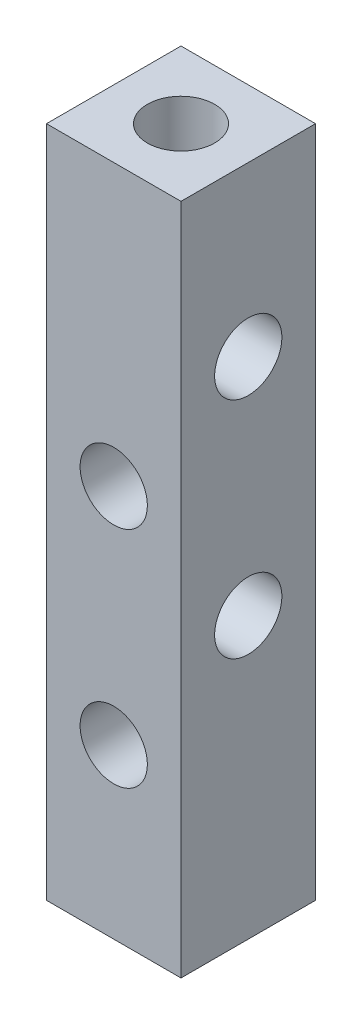
ISO-10303-21;
HEADER;
FILE_DESCRIPTION(('STEP AP214'),'2;1');
FILE_NAME('part.step','',(''),(''),'','','');
FILE_SCHEMA(('AUTOMOTIVE_DESIGN { 1 0 10303 214 1 1 1 1 }'));
ENDSEC;
DATA;
#1=APPLICATION_CONTEXT('core data for automotive mechanical design processes');
#2=APPLICATION_PROTOCOL_DEFINITION('international standard','automotive_design',2000,#1);
#3=PRODUCT_CONTEXT('',#1,'mechanical');
#4=PRODUCT('Part','Part','',(#3));
#5=PRODUCT_RELATED_PRODUCT_CATEGORY('part','',(#4));
#6=PRODUCT_DEFINITION_FORMATION('','',#4);
#7=PRODUCT_DEFINITION_CONTEXT('part definition',#1,'design');
#8=PRODUCT_DEFINITION('design','',#6,#7);
#9=PRODUCT_DEFINITION_SHAPE('','',#8);
#10=(LENGTH_UNIT() NAMED_UNIT(*) SI_UNIT(.MILLI.,.METRE.));
#11=(NAMED_UNIT(*) PLANE_ANGLE_UNIT() SI_UNIT($,.RADIAN.));
#12=(NAMED_UNIT(*) SI_UNIT($,.STERADIAN.) SOLID_ANGLE_UNIT());
#13=UNCERTAINTY_MEASURE_WITH_UNIT(LENGTH_MEASURE(1.E-05),#10,'distance_accuracy_value','');
#14=(GEOMETRIC_REPRESENTATION_CONTEXT(3) GLOBAL_UNCERTAINTY_ASSIGNED_CONTEXT((#13)) GLOBAL_UNIT_ASSIGNED_CONTEXT((#10,
#11,#12)) REPRESENTATION_CONTEXT('',''));
#15=CARTESIAN_POINT('',(0.,0.,0.));
#16=DIRECTION('',(0.,0.,1.));
#17=DIRECTION('',(1.,0.,0.));
#18=AXIS2_PLACEMENT_3D('',#15,#16,#17);
#19=CARTESIAN_POINT('',(3.,30.,3.));
#20=DIRECTION('',(-1.,0.,0.));
#21=DIRECTION('',(0.,0.,1.));
#22=AXIS2_PLACEMENT_3D('',#19,#20,#21);
#23=PLANE('',#22);
#24=CARTESIAN_POINT('',(3.,22.5,0.));
#25=DIRECTION('',(1.,0.,0.));
#26=DIRECTION('',(0.,0.,-1.));
#27=AXIS2_PLACEMENT_3D('',#24,#25,#26);
#28=CIRCLE('',#27,1.5);
#29=CARTESIAN_POINT('',(3.,22.5,-1.5));
#30=VERTEX_POINT('',#29);
#31=EDGE_CURVE('E126',#30,#30,#28,.T.);
#32=ORIENTED_EDGE('',*,*,#31,.F.);
#33=EDGE_LOOP('',(#32));
#34=FACE_BOUND('',#33,.T.);
#35=CARTESIAN_POINT('',(3.,12.5,0.));
#36=DIRECTION('',(1.,0.,0.));
#37=DIRECTION('',(0.,0.,-1.));
#38=AXIS2_PLACEMENT_3D('',#35,#36,#37);
#39=CIRCLE('',#38,1.5);
#40=CARTESIAN_POINT('',(3.,12.5,-1.5));
#41=VERTEX_POINT('',#40);
#42=EDGE_CURVE('E127',#41,#41,#39,.T.);
#43=ORIENTED_EDGE('',*,*,#42,.F.);
#44=EDGE_LOOP('',(#43));
#45=FACE_BOUND('',#44,.T.);
#46=DIRECTION('',(0.,0.,-1.));
#47=VECTOR('',#46,1.);
#48=CARTESIAN_POINT('',(3.,0.,3.));
#49=LINE('',#48,#47);
#50=CARTESIAN_POINT('',(3.,0.,3.));
#51=VERTEX_POINT('',#50);
#52=CARTESIAN_POINT('',(3.,0.,-3.));
#53=VERTEX_POINT('',#52);
#54=EDGE_CURVE('E97',#51,#53,#49,.T.);
#55=ORIENTED_EDGE('',*,*,#54,.T.);
#56=DIRECTION('',(0.,-1.,0.));
#57=VECTOR('',#56,1.);
#58=CARTESIAN_POINT('',(3.,30.,-3.));
#59=LINE('',#58,#57);
#60=CARTESIAN_POINT('',(3.,30.,-3.));
#61=VERTEX_POINT('',#60);
#62=EDGE_CURVE('E11',#61,#53,#59,.T.);
#63=ORIENTED_EDGE('',*,*,#62,.F.);
#64=DIRECTION('',(0.,0.,-1.));
#65=VECTOR('',#64,1.);
#66=CARTESIAN_POINT('',(3.,30.,3.));
#67=LINE('',#66,#65);
#68=CARTESIAN_POINT('',(3.,30.,3.));
#69=VERTEX_POINT('',#68);
#70=EDGE_CURVE('E85',#69,#61,#67,.T.);
#71=ORIENTED_EDGE('',*,*,#70,.F.);
#72=DIRECTION('',(0.,-1.,0.));
#73=VECTOR('',#72,1.);
#74=CARTESIAN_POINT('',(3.,30.,3.));
#75=LINE('',#74,#73);
#76=EDGE_CURVE('E93',#69,#51,#75,.T.);
#77=ORIENTED_EDGE('',*,*,#76,.T.);
#78=EDGE_LOOP('',(#55,#63,#71,#77));
#79=FACE_BOUND('',#78,.T.);
#80=ADVANCED_FACE('F34',(#34,#45,#79),#23,.F.);
#81=CARTESIAN_POINT('',(-3.,30.,-3.));
#82=DIRECTION('',(0.,0.,1.));
#83=DIRECTION('',(1.,0.,0.));
#84=AXIS2_PLACEMENT_3D('',#81,#82,#83);
#85=PLANE('',#84);
#86=CARTESIAN_POINT('',(0.,17.5,-3.));
#87=DIRECTION('',(0.,0.,1.));
#88=DIRECTION('',(1.,0.,0.));
#89=AXIS2_PLACEMENT_3D('',#86,#87,#88);
#90=CIRCLE('',#89,1.5);
#91=CARTESIAN_POINT('',(1.5,17.5,-3.));
#92=VERTEX_POINT('',#91);
#93=EDGE_CURVE('E100',#92,#92,#90,.F.);
#94=ORIENTED_EDGE('',*,*,#93,.F.);
#95=EDGE_LOOP('',(#94));
#96=FACE_BOUND('',#95,.T.);
#97=CARTESIAN_POINT('',(0.,7.5,-3.));
#98=DIRECTION('',(0.,0.,1.));
#99=DIRECTION('',(1.,0.,0.));
#100=AXIS2_PLACEMENT_3D('',#97,#98,#99);
#101=CIRCLE('',#100,1.5);
#102=CARTESIAN_POINT('',(1.5,7.5,-3.));
#103=VERTEX_POINT('',#102);
#104=EDGE_CURVE('E111',#103,#103,#101,.F.);
#105=ORIENTED_EDGE('',*,*,#104,.F.);
#106=EDGE_LOOP('',(#105));
#107=FACE_BOUND('',#106,.T.);
#108=DIRECTION('',(-1.,0.,0.));
#109=VECTOR('',#108,1.);
#110=CARTESIAN_POINT('',(-3.,0.,-3.));
#111=LINE('',#110,#109);
#112=CARTESIAN_POINT('',(-3.,0.,-3.));
#113=VERTEX_POINT('',#112);
#114=EDGE_CURVE('E89',#53,#113,#111,.T.);
#115=ORIENTED_EDGE('',*,*,#114,.T.);
#116=DIRECTION('',(0.,-1.,0.));
#117=VECTOR('',#116,1.);
#118=CARTESIAN_POINT('',(-3.,30.,-3.));
#119=LINE('',#118,#117);
#120=CARTESIAN_POINT('',(-3.,30.,-3.));
#121=VERTEX_POINT('',#120);
#122=EDGE_CURVE('E42',#121,#113,#119,.T.);
#123=ORIENTED_EDGE('',*,*,#122,.F.);
#124=DIRECTION('',(-1.,0.,0.));
#125=VECTOR('',#124,1.);
#126=CARTESIAN_POINT('',(-3.,30.,-3.));
#127=LINE('',#126,#125);
#128=EDGE_CURVE('E80',#61,#121,#127,.T.);
#129=ORIENTED_EDGE('',*,*,#128,.F.);
#130=ORIENTED_EDGE('',*,*,#62,.T.);
#131=EDGE_LOOP('',(#115,#123,#129,#130));
#132=FACE_BOUND('',#131,.T.);
#133=ADVANCED_FACE('F88',(#96,#107,#132),#85,.F.);
#134=CARTESIAN_POINT('',(-3.,30.,3.));
#135=DIRECTION('',(1.,0.,0.));
#136=DIRECTION('',(0.,0.,-1.));
#137=AXIS2_PLACEMENT_3D('',#134,#135,#136);
#138=PLANE('',#137);
#139=CARTESIAN_POINT('',(-3.,22.5,0.));
#140=DIRECTION('',(1.,0.,0.));
#141=DIRECTION('',(0.,0.,-1.));
#142=AXIS2_PLACEMENT_3D('',#139,#140,#141);
#143=CIRCLE('',#142,1.5);
#144=CARTESIAN_POINT('',(-3.,22.5,-1.5));
#145=VERTEX_POINT('',#144);
#146=EDGE_CURVE('E118',#145,#145,#143,.F.);
#147=ORIENTED_EDGE('',*,*,#146,.F.);
#148=EDGE_LOOP('',(#147));
#149=FACE_BOUND('',#148,.T.);
#150=CARTESIAN_POINT('',(-3.,12.5,0.));
#151=DIRECTION('',(1.,0.,0.));
#152=DIRECTION('',(0.,0.,-1.));
#153=AXIS2_PLACEMENT_3D('',#150,#151,#152);
#154=CIRCLE('',#153,1.5);
#155=CARTESIAN_POINT('',(-3.,12.5,-1.5));
#156=VERTEX_POINT('',#155);
#157=EDGE_CURVE('E123',#156,#156,#154,.F.);
#158=ORIENTED_EDGE('',*,*,#157,.F.);
#159=EDGE_LOOP('',(#158));
#160=FACE_BOUND('',#159,.T.);
#161=DIRECTION('',(0.,0.,1.));
#162=VECTOR('',#161,1.);
#163=CARTESIAN_POINT('',(-3.,0.,3.));
#164=LINE('',#163,#162);
#165=CARTESIAN_POINT('',(-3.,0.,3.));
#166=VERTEX_POINT('',#165);
#167=EDGE_CURVE('E67',#113,#166,#164,.T.);
#168=ORIENTED_EDGE('',*,*,#167,.T.);
#169=DIRECTION('',(0.,-1.,0.));
#170=VECTOR('',#169,1.);
#171=CARTESIAN_POINT('',(-3.,30.,3.));
#172=LINE('',#171,#170);
#173=CARTESIAN_POINT('',(-3.,30.,3.));
#174=VERTEX_POINT('',#173);
#175=EDGE_CURVE('E90',#174,#166,#172,.T.);
#176=ORIENTED_EDGE('',*,*,#175,.F.);
#177=DIRECTION('',(0.,0.,1.));
#178=VECTOR('',#177,1.);
#179=CARTESIAN_POINT('',(-3.,30.,3.));
#180=LINE('',#179,#178);
#181=EDGE_CURVE('E83',#121,#174,#180,.T.);
#182=ORIENTED_EDGE('',*,*,#181,.F.);
#183=ORIENTED_EDGE('',*,*,#122,.T.);
#184=EDGE_LOOP('',(#168,#176,#182,#183));
#185=FACE_BOUND('',#184,.T.);
#186=ADVANCED_FACE('F91',(#149,#160,#185),#138,.F.);
#187=CARTESIAN_POINT('',(-3.,30.,3.));
#188=DIRECTION('',(0.,0.,-1.));
#189=DIRECTION('',(-1.,0.,0.));
#190=AXIS2_PLACEMENT_3D('',#187,#188,#189);
#191=PLANE('',#190);
#192=CARTESIAN_POINT('',(0.,17.5,3.));
#193=DIRECTION('',(0.,0.,1.));
#194=DIRECTION('',(1.,0.,0.));
#195=AXIS2_PLACEMENT_3D('',#192,#193,#194);
#196=CIRCLE('',#195,1.5);
#197=CARTESIAN_POINT('',(1.5,17.5,3.));
#198=VERTEX_POINT('',#197);
#199=EDGE_CURVE('E114',#198,#198,#196,.T.);
#200=ORIENTED_EDGE('',*,*,#199,.F.);
#201=EDGE_LOOP('',(#200));
#202=FACE_BOUND('',#201,.T.);
#203=CARTESIAN_POINT('',(0.,7.5,3.));
#204=DIRECTION('',(0.,0.,1.));
#205=DIRECTION('',(1.,0.,0.));
#206=AXIS2_PLACEMENT_3D('',#203,#204,#205);
#207=CIRCLE('',#206,1.5);
#208=CARTESIAN_POINT('',(1.5,7.5,3.));
#209=VERTEX_POINT('',#208);
#210=EDGE_CURVE('E115',#209,#209,#207,.T.);
#211=ORIENTED_EDGE('',*,*,#210,.F.);
#212=EDGE_LOOP('',(#211));
#213=FACE_BOUND('',#212,.T.);
#214=DIRECTION('',(1.,0.,0.));
#215=VECTOR('',#214,1.);
#216=CARTESIAN_POINT('',(-3.,0.,3.));
#217=LINE('',#216,#215);
#218=EDGE_CURVE('E73',#166,#51,#217,.T.);
#219=ORIENTED_EDGE('',*,*,#218,.T.);
#220=ORIENTED_EDGE('',*,*,#76,.F.);
#221=DIRECTION('',(1.,0.,0.));
#222=VECTOR('',#221,1.);
#223=CARTESIAN_POINT('',(-3.,30.,3.));
#224=LINE('',#223,#222);
#225=EDGE_CURVE('E50',#174,#69,#224,.T.);
#226=ORIENTED_EDGE('',*,*,#225,.F.);
#227=ORIENTED_EDGE('',*,*,#175,.T.);
#228=EDGE_LOOP('',(#219,#220,#226,#227));
#229=FACE_BOUND('',#228,.T.);
#230=ADVANCED_FACE('F105',(#202,#213,#229),#191,.F.);
#231=CARTESIAN_POINT('',(0.,30.,0.));
#232=DIRECTION('',(0.,-1.,0.));
#233=DIRECTION('',(0.,0.,-1.));
#234=AXIS2_PLACEMENT_3D('',#231,#232,#233);
#235=PLANE('',#234);
#236=CARTESIAN_POINT('',(0.,30.,0.));
#237=DIRECTION('',(0.,1.,0.));
#238=DIRECTION('',(0.,0.,1.));
#239=AXIS2_PLACEMENT_3D('',#236,#237,#238);
#240=CIRCLE('',#239,1.5);
#241=CARTESIAN_POINT('',(0.,30.,1.5));
#242=VERTEX_POINT('',#241);
#243=EDGE_CURVE('E135',#242,#242,#240,.T.);
#244=ORIENTED_EDGE('',*,*,#243,.F.);
#245=EDGE_LOOP('',(#244));
#246=FACE_BOUND('',#245,.T.);
#247=ORIENTED_EDGE('',*,*,#70,.T.);
#248=ORIENTED_EDGE('',*,*,#128,.T.);
#249=ORIENTED_EDGE('',*,*,#181,.T.);
#250=ORIENTED_EDGE('',*,*,#225,.T.);
#251=EDGE_LOOP('',(#247,#248,#249,#250));
#252=FACE_BOUND('',#251,.T.);
#253=ADVANCED_FACE('F81',(#246,#252),#235,.F.);
#254=CARTESIAN_POINT('',(0.,0.,0.));
#255=DIRECTION('',(0.,-1.,0.));
#256=DIRECTION('',(0.,0.,-1.));
#257=AXIS2_PLACEMENT_3D('',#254,#255,#256);
#258=PLANE('',#257);
#259=CARTESIAN_POINT('',(0.,0.,0.));
#260=DIRECTION('',(0.,-1.,0.));
#261=DIRECTION('',(0.,0.,-1.));
#262=AXIS2_PLACEMENT_3D('',#259,#260,#261);
#263=CIRCLE('',#262,1.5);
#264=CARTESIAN_POINT('',(0.,0.,-1.5));
#265=VERTEX_POINT('',#264);
#266=EDGE_CURVE('E141',#265,#265,#263,.T.);
#267=ORIENTED_EDGE('',*,*,#266,.F.);
#268=EDGE_LOOP('',(#267));
#269=FACE_BOUND('',#268,.T.);
#270=ORIENTED_EDGE('',*,*,#54,.F.);
#271=ORIENTED_EDGE('',*,*,#218,.F.);
#272=ORIENTED_EDGE('',*,*,#167,.F.);
#273=ORIENTED_EDGE('',*,*,#114,.F.);
#274=EDGE_LOOP('',(#270,#271,#272,#273));
#275=FACE_BOUND('',#274,.T.);
#276=ADVANCED_FACE('F108',(#269,#275),#258,.T.);
#277=CARTESIAN_POINT('',(0.,7.5,-3.001));
#278=DIRECTION('',(0.,0.,1.));
#279=DIRECTION('',(1.,0.,0.));
#280=AXIS2_PLACEMENT_3D('',#277,#278,#279);
#281=CYLINDRICAL_SURFACE('',#280,1.5);
#282=CARTESIAN_POINT('',(1.5,7.5,3.));
#283=CARTESIAN_POINT('',(1.5,7.5,2.9375));
#284=CARTESIAN_POINT('',(1.5,7.5,2.875));
#285=CARTESIAN_POINT('',(1.5,7.5,2.75));
#286=CARTESIAN_POINT('',(1.5,7.5,2.6875));
#287=CARTESIAN_POINT('',(1.5,7.5,2.5625));
#288=CARTESIAN_POINT('',(1.5,7.5,2.5));
#289=CARTESIAN_POINT('',(1.5,7.5,2.375));
#290=CARTESIAN_POINT('',(1.5,7.5,2.3125));
#291=CARTESIAN_POINT('',(1.5,7.5,2.1875));
#292=CARTESIAN_POINT('',(1.5,7.5,2.125));
#293=CARTESIAN_POINT('',(1.5,7.5,2.));
#294=CARTESIAN_POINT('',(1.5,7.5,1.9375));
#295=CARTESIAN_POINT('',(1.5,7.5,1.8125));
#296=CARTESIAN_POINT('',(1.5,7.5,1.75));
#297=CARTESIAN_POINT('',(1.5,7.5,1.625));
#298=CARTESIAN_POINT('',(1.5,7.5,1.5625));
#299=CARTESIAN_POINT('',(1.5,7.5,1.4375));
#300=CARTESIAN_POINT('',(1.5,7.5,1.375));
#301=CARTESIAN_POINT('',(1.5,7.5,1.25));
#302=CARTESIAN_POINT('',(1.5,7.5,1.1875));
#303=CARTESIAN_POINT('',(1.5,7.5,1.0625));
#304=CARTESIAN_POINT('',(1.5,7.5,1.));
#305=CARTESIAN_POINT('',(1.5,7.5,0.875));
#306=CARTESIAN_POINT('',(1.5,7.5,0.8125));
#307=CARTESIAN_POINT('',(1.5,7.5,0.6875));
#308=CARTESIAN_POINT('',(1.5,7.5,0.625));
#309=CARTESIAN_POINT('',(1.5,7.5,0.5));
#310=CARTESIAN_POINT('',(1.5,7.5,0.4375));
#311=CARTESIAN_POINT('',(1.5,7.5,0.3125));
#312=CARTESIAN_POINT('',(1.5,7.5,0.25));
#313=CARTESIAN_POINT('',(1.5,7.5,0.125));
#314=CARTESIAN_POINT('',(1.5,7.5,0.0624999999999996));
#315=CARTESIAN_POINT('',(1.5,7.5,-0.0625000000000005));
#316=CARTESIAN_POINT('',(1.5,7.5,-0.125000000000001));
#317=CARTESIAN_POINT('',(1.5,7.5,-0.250000000000001));
#318=CARTESIAN_POINT('',(1.5,7.5,-0.3125));
#319=CARTESIAN_POINT('',(1.5,7.5,-0.4375));
#320=CARTESIAN_POINT('',(1.5,7.5,-0.5));
#321=CARTESIAN_POINT('',(1.5,7.5,-0.625000000000001));
#322=CARTESIAN_POINT('',(1.5,7.5,-0.687500000000001));
#323=CARTESIAN_POINT('',(1.5,7.5,-0.812500000000001));
#324=CARTESIAN_POINT('',(1.5,7.5,-0.875000000000001));
#325=CARTESIAN_POINT('',(1.5,7.5,-1.));
#326=CARTESIAN_POINT('',(1.5,7.5,-1.0625));
#327=CARTESIAN_POINT('',(1.5,7.5,-1.1875));
#328=CARTESIAN_POINT('',(1.5,7.5,-1.25));
#329=CARTESIAN_POINT('',(1.5,7.5,-1.375));
#330=CARTESIAN_POINT('',(1.5,7.5,-1.4375));
#331=CARTESIAN_POINT('',(1.5,7.5,-1.5625));
#332=CARTESIAN_POINT('',(1.5,7.5,-1.625));
#333=CARTESIAN_POINT('',(1.5,7.5,-1.75));
#334=CARTESIAN_POINT('',(1.5,7.5,-1.8125));
#335=CARTESIAN_POINT('',(1.5,7.5,-1.9375));
#336=CARTESIAN_POINT('',(1.5,7.5,-2.));
#337=CARTESIAN_POINT('',(1.5,7.5,-2.125));
#338=CARTESIAN_POINT('',(1.5,7.5,-2.1875));
#339=CARTESIAN_POINT('',(1.5,7.5,-2.3125));
#340=CARTESIAN_POINT('',(1.5,7.5,-2.375));
#341=CARTESIAN_POINT('',(1.5,7.5,-2.5));
#342=CARTESIAN_POINT('',(1.5,7.5,-2.5625));
#343=CARTESIAN_POINT('',(1.5,7.5,-2.6875));
#344=CARTESIAN_POINT('',(1.5,7.5,-2.75));
#345=CARTESIAN_POINT('',(1.5,7.5,-2.875));
#346=CARTESIAN_POINT('',(1.5,7.5,-2.9375));
#347=CARTESIAN_POINT('',(1.5,7.5,-3.));
#348=B_SPLINE_CURVE_WITH_KNOTS('',3,(#282,#283,#284,#285,#286,#287,#288,#289,#290,#291,#292,
#293,#294,#295,#296,#297,#298,#299,#300,#301,#302,#303,#304,#305,#306,#307,#308,#309,#310,#311,
#312,#313,#314,#315,#316,#317,#318,#319,#320,#321,#322,#323,#324,#325,#326,#327,#328,#329,#330,
#331,#332,#333,#334,#335,#336,#337,#338,#339,#340,#341,#342,#343,#344,#345,#346,#347),
.UNSPECIFIED.,.F.,.F.,(4,2,2,2,2,2,2,2,2,2,2,2,2,2,2,2,2,2,2,2,2,2,2,2,2,2,2,2,2,2,2,2,4),(0.,
0.1875,0.375,0.5625,0.75,0.9375,1.125,1.3125,1.5,1.6875,1.875,2.0625,2.25,2.4375,2.625,2.8125,
3.,3.1875,3.375,3.5625,3.75,3.9375,4.125,4.3125,4.5,4.6875,4.875,5.0625,5.25,5.4375,5.625,
5.8125,6.),.UNSPECIFIED.);
#349=EDGE_CURVE('BSEAM157',#209,#103,#348,.T.);
#350=ORIENTED_EDGE('',*,*,#210,.T.);
#351=ORIENTED_EDGE('',*,*,#104,.T.);
#352=ORIENTED_EDGE('',*,*,#349,.T.);
#353=ORIENTED_EDGE('',*,*,#349,.F.);
#354=EDGE_LOOP('',(#350,#352,#351,#353));
#355=FACE_BOUND('',#354,.T.);
#356=ADVANCED_FACE('F157',(#355),#281,.F.);
#357=CARTESIAN_POINT('',(0.,17.5,-3.001));
#358=DIRECTION('',(0.,0.,1.));
#359=DIRECTION('',(1.,0.,0.));
#360=AXIS2_PLACEMENT_3D('',#357,#358,#359);
#361=CYLINDRICAL_SURFACE('',#360,1.5);
#362=CARTESIAN_POINT('',(1.5,17.5,3.));
#363=CARTESIAN_POINT('',(1.5,17.5,2.9375));
#364=CARTESIAN_POINT('',(1.5,17.5,2.875));
#365=CARTESIAN_POINT('',(1.5,17.5,2.75));
#366=CARTESIAN_POINT('',(1.5,17.5,2.6875));
#367=CARTESIAN_POINT('',(1.5,17.5,2.5625));
#368=CARTESIAN_POINT('',(1.5,17.5,2.5));
#369=CARTESIAN_POINT('',(1.5,17.5,2.375));
#370=CARTESIAN_POINT('',(1.5,17.5,2.3125));
#371=CARTESIAN_POINT('',(1.5,17.5,2.1875));
#372=CARTESIAN_POINT('',(1.5,17.5,2.125));
#373=CARTESIAN_POINT('',(1.5,17.5,2.));
#374=CARTESIAN_POINT('',(1.5,17.5,1.9375));
#375=CARTESIAN_POINT('',(1.5,17.5,1.8125));
#376=CARTESIAN_POINT('',(1.5,17.5,1.75));
#377=CARTESIAN_POINT('',(1.5,17.5,1.625));
#378=CARTESIAN_POINT('',(1.5,17.5,1.5625));
#379=CARTESIAN_POINT('',(1.5,17.5,1.4375));
#380=CARTESIAN_POINT('',(1.5,17.5,1.375));
#381=CARTESIAN_POINT('',(1.5,17.5,1.25));
#382=CARTESIAN_POINT('',(1.5,17.5,1.1875));
#383=CARTESIAN_POINT('',(1.5,17.5,1.0625));
#384=CARTESIAN_POINT('',(1.5,17.5,1.));
#385=CARTESIAN_POINT('',(1.5,17.5,0.875));
#386=CARTESIAN_POINT('',(1.5,17.5,0.8125));
#387=CARTESIAN_POINT('',(1.5,17.5,0.6875));
#388=CARTESIAN_POINT('',(1.5,17.5,0.625));
#389=CARTESIAN_POINT('',(1.5,17.5,0.5));
#390=CARTESIAN_POINT('',(1.5,17.5,0.4375));
#391=CARTESIAN_POINT('',(1.5,17.5,0.3125));
#392=CARTESIAN_POINT('',(1.5,17.5,0.25));
#393=CARTESIAN_POINT('',(1.5,17.5,0.125));
#394=CARTESIAN_POINT('',(1.5,17.5,0.0624999999999996));
#395=CARTESIAN_POINT('',(1.5,17.5,-0.0625000000000005));
#396=CARTESIAN_POINT('',(1.5,17.5,-0.125000000000001));
#397=CARTESIAN_POINT('',(1.5,17.5,-0.250000000000001));
#398=CARTESIAN_POINT('',(1.5,17.5,-0.3125));
#399=CARTESIAN_POINT('',(1.5,17.5,-0.4375));
#400=CARTESIAN_POINT('',(1.5,17.5,-0.5));
#401=CARTESIAN_POINT('',(1.5,17.5,-0.625000000000001));
#402=CARTESIAN_POINT('',(1.5,17.5,-0.687500000000001));
#403=CARTESIAN_POINT('',(1.5,17.5,-0.812500000000001));
#404=CARTESIAN_POINT('',(1.5,17.5,-0.875000000000001));
#405=CARTESIAN_POINT('',(1.5,17.5,-1.));
#406=CARTESIAN_POINT('',(1.5,17.5,-1.0625));
#407=CARTESIAN_POINT('',(1.5,17.5,-1.1875));
#408=CARTESIAN_POINT('',(1.5,17.5,-1.25));
#409=CARTESIAN_POINT('',(1.5,17.5,-1.375));
#410=CARTESIAN_POINT('',(1.5,17.5,-1.4375));
#411=CARTESIAN_POINT('',(1.5,17.5,-1.5625));
#412=CARTESIAN_POINT('',(1.5,17.5,-1.625));
#413=CARTESIAN_POINT('',(1.5,17.5,-1.75));
#414=CARTESIAN_POINT('',(1.5,17.5,-1.8125));
#415=CARTESIAN_POINT('',(1.5,17.5,-1.9375));
#416=CARTESIAN_POINT('',(1.5,17.5,-2.));
#417=CARTESIAN_POINT('',(1.5,17.5,-2.125));
#418=CARTESIAN_POINT('',(1.5,17.5,-2.1875));
#419=CARTESIAN_POINT('',(1.5,17.5,-2.3125));
#420=CARTESIAN_POINT('',(1.5,17.5,-2.375));
#421=CARTESIAN_POINT('',(1.5,17.5,-2.5));
#422=CARTESIAN_POINT('',(1.5,17.5,-2.5625));
#423=CARTESIAN_POINT('',(1.5,17.5,-2.6875));
#424=CARTESIAN_POINT('',(1.5,17.5,-2.75));
#425=CARTESIAN_POINT('',(1.5,17.5,-2.875));
#426=CARTESIAN_POINT('',(1.5,17.5,-2.9375));
#427=CARTESIAN_POINT('',(1.5,17.5,-3.));
#428=B_SPLINE_CURVE_WITH_KNOTS('',3,(#362,#363,#364,#365,#366,#367,#368,#369,#370,#371,#372,
#373,#374,#375,#376,#377,#378,#379,#380,#381,#382,#383,#384,#385,#386,#387,#388,#389,#390,#391,
#392,#393,#394,#395,#396,#397,#398,#399,#400,#401,#402,#403,#404,#405,#406,#407,#408,#409,#410,
#411,#412,#413,#414,#415,#416,#417,#418,#419,#420,#421,#422,#423,#424,#425,#426,#427),
.UNSPECIFIED.,.F.,.F.,(4,2,2,2,2,2,2,2,2,2,2,2,2,2,2,2,2,2,2,2,2,2,2,2,2,2,2,2,2,2,2,2,4),(0.,
0.1875,0.375,0.5625,0.75,0.9375,1.125,1.3125,1.5,1.6875,1.875,2.0625,2.25,2.4375,2.625,2.8125,
3.,3.1875,3.375,3.5625,3.75,3.9375,4.125,4.3125,4.5,4.6875,4.875,5.0625,5.25,5.4375,5.625,
5.8125,6.),.UNSPECIFIED.);
#429=EDGE_CURVE('BSEAM163',#198,#92,#428,.T.);
#430=ORIENTED_EDGE('',*,*,#199,.T.);
#431=ORIENTED_EDGE('',*,*,#93,.T.);
#432=ORIENTED_EDGE('',*,*,#429,.T.);
#433=ORIENTED_EDGE('',*,*,#429,.F.);
#434=EDGE_LOOP('',(#430,#432,#431,#433));
#435=FACE_BOUND('',#434,.T.);
#436=ADVANCED_FACE('F163',(#435),#361,.F.);
#437=CARTESIAN_POINT('',(-3.001,12.5,0.));
#438=DIRECTION('',(1.,0.,0.));
#439=DIRECTION('',(0.,0.,-1.));
#440=AXIS2_PLACEMENT_3D('',#437,#438,#439);
#441=CYLINDRICAL_SURFACE('',#440,1.5);
#442=CARTESIAN_POINT('',(3.,12.5,-1.5));
#443=CARTESIAN_POINT('',(2.9375,12.5,-1.5));
#444=CARTESIAN_POINT('',(2.875,12.5,-1.5));
#445=CARTESIAN_POINT('',(2.75,12.5,-1.5));
#446=CARTESIAN_POINT('',(2.6875,12.5,-1.5));
#447=CARTESIAN_POINT('',(2.5625,12.5,-1.5));
#448=CARTESIAN_POINT('',(2.5,12.5,-1.5));
#449=CARTESIAN_POINT('',(2.375,12.5,-1.5));
#450=CARTESIAN_POINT('',(2.3125,12.5,-1.5));
#451=CARTESIAN_POINT('',(2.1875,12.5,-1.5));
#452=CARTESIAN_POINT('',(2.125,12.5,-1.5));
#453=CARTESIAN_POINT('',(2.,12.5,-1.5));
#454=CARTESIAN_POINT('',(1.9375,12.5,-1.5));
#455=CARTESIAN_POINT('',(1.8125,12.5,-1.5));
#456=CARTESIAN_POINT('',(1.75,12.5,-1.5));
#457=CARTESIAN_POINT('',(1.625,12.5,-1.5));
#458=CARTESIAN_POINT('',(1.5625,12.5,-1.5));
#459=CARTESIAN_POINT('',(1.4375,12.5,-1.5));
#460=CARTESIAN_POINT('',(1.375,12.5,-1.5));
#461=CARTESIAN_POINT('',(1.25,12.5,-1.5));
#462=CARTESIAN_POINT('',(1.1875,12.5,-1.5));
#463=CARTESIAN_POINT('',(1.0625,12.5,-1.5));
#464=CARTESIAN_POINT('',(1.,12.5,-1.5));
#465=CARTESIAN_POINT('',(0.875000000000001,12.5,-1.5));
#466=CARTESIAN_POINT('',(0.812500000000001,12.5,-1.5));
#467=CARTESIAN_POINT('',(0.687500000000001,12.5,-1.5));
#468=CARTESIAN_POINT('',(0.625000000000001,12.5,-1.5));
#469=CARTESIAN_POINT('',(0.500000000000001,12.5,-1.5));
#470=CARTESIAN_POINT('',(0.437500000000001,12.5,-1.5));
#471=CARTESIAN_POINT('',(0.312500000000001,12.5,-1.5));
#472=CARTESIAN_POINT('',(0.250000000000001,12.5,-1.5));
#473=CARTESIAN_POINT('',(0.125000000000001,12.5,-1.5));
#474=CARTESIAN_POINT('',(0.0625000000000013,12.5,-1.5));
#475=CARTESIAN_POINT('',(-0.0624999999999987,12.5,-1.5));
#476=CARTESIAN_POINT('',(-0.124999999999999,12.5,-1.5));
#477=CARTESIAN_POINT('',(-0.249999999999999,12.5,-1.5));
#478=CARTESIAN_POINT('',(-0.312499999999999,12.5,-1.5));
#479=CARTESIAN_POINT('',(-0.437499999999999,12.5,-1.5));
#480=CARTESIAN_POINT('',(-0.499999999999999,12.5,-1.5));
#481=CARTESIAN_POINT('',(-0.624999999999999,12.5,-1.5));
#482=CARTESIAN_POINT('',(-0.687499999999999,12.5,-1.5));
#483=CARTESIAN_POINT('',(-0.812499999999999,12.5,-1.5));
#484=CARTESIAN_POINT('',(-0.874999999999999,12.5,-1.5));
#485=CARTESIAN_POINT('',(-0.999999999999999,12.5,-1.5));
#486=CARTESIAN_POINT('',(-1.0625,12.5,-1.5));
#487=CARTESIAN_POINT('',(-1.1875,12.5,-1.5));
#488=CARTESIAN_POINT('',(-1.25,12.5,-1.5));
#489=CARTESIAN_POINT('',(-1.375,12.5,-1.5));
#490=CARTESIAN_POINT('',(-1.4375,12.5,-1.5));
#491=CARTESIAN_POINT('',(-1.5625,12.5,-1.5));
#492=CARTESIAN_POINT('',(-1.625,12.5,-1.5));
#493=CARTESIAN_POINT('',(-1.75,12.5,-1.5));
#494=CARTESIAN_POINT('',(-1.8125,12.5,-1.5));
#495=CARTESIAN_POINT('',(-1.9375,12.5,-1.5));
#496=CARTESIAN_POINT('',(-2.,12.5,-1.5));
#497=CARTESIAN_POINT('',(-2.125,12.5,-1.5));
#498=CARTESIAN_POINT('',(-2.1875,12.5,-1.5));
#499=CARTESIAN_POINT('',(-2.3125,12.5,-1.5));
#500=CARTESIAN_POINT('',(-2.375,12.5,-1.5));
#501=CARTESIAN_POINT('',(-2.5,12.5,-1.5));
#502=CARTESIAN_POINT('',(-2.5625,12.5,-1.5));
#503=CARTESIAN_POINT('',(-2.6875,12.5,-1.5));
#504=CARTESIAN_POINT('',(-2.75,12.5,-1.5));
#505=CARTESIAN_POINT('',(-2.875,12.5,-1.5));
#506=CARTESIAN_POINT('',(-2.9375,12.5,-1.5));
#507=CARTESIAN_POINT('',(-3.,12.5,-1.5));
#508=B_SPLINE_CURVE_WITH_KNOTS('',3,(#442,#443,#444,#445,#446,#447,#448,#449,#450,#451,#452,
#453,#454,#455,#456,#457,#458,#459,#460,#461,#462,#463,#464,#465,#466,#467,#468,#469,#470,#471,
#472,#473,#474,#475,#476,#477,#478,#479,#480,#481,#482,#483,#484,#485,#486,#487,#488,#489,#490,
#491,#492,#493,#494,#495,#496,#497,#498,#499,#500,#501,#502,#503,#504,#505,#506,#507),
.UNSPECIFIED.,.F.,.F.,(4,2,2,2,2,2,2,2,2,2,2,2,2,2,2,2,2,2,2,2,2,2,2,2,2,2,2,2,2,2,2,2,4),(0.,
0.1875,0.375,0.5625,0.75,0.9375,1.125,1.3125,1.5,1.6875,1.875,2.0625,2.25,2.4375,2.625,2.8125,
3.,3.1875,3.375,3.5625,3.75,3.9375,4.125,4.3125,4.5,4.6875,4.875,5.0625,5.25,5.4375,5.625,
5.8125,6.),.UNSPECIFIED.);
#509=EDGE_CURVE('BSEAM179',#41,#156,#508,.T.);
#510=ORIENTED_EDGE('',*,*,#42,.T.);
#511=ORIENTED_EDGE('',*,*,#157,.T.);
#512=ORIENTED_EDGE('',*,*,#509,.T.);
#513=ORIENTED_EDGE('',*,*,#509,.F.);
#514=EDGE_LOOP('',(#510,#512,#511,#513));
#515=FACE_BOUND('',#514,.T.);
#516=ADVANCED_FACE('F179',(#515),#441,.F.);
#517=CARTESIAN_POINT('',(-3.001,22.5,0.));
#518=DIRECTION('',(1.,0.,0.));
#519=DIRECTION('',(0.,0.,-1.));
#520=AXIS2_PLACEMENT_3D('',#517,#518,#519);
#521=CYLINDRICAL_SURFACE('',#520,1.5);
#522=CARTESIAN_POINT('',(3.,22.5,-1.5));
#523=CARTESIAN_POINT('',(2.9375,22.5,-1.5));
#524=CARTESIAN_POINT('',(2.875,22.5,-1.5));
#525=CARTESIAN_POINT('',(2.75,22.5,-1.5));
#526=CARTESIAN_POINT('',(2.6875,22.5,-1.5));
#527=CARTESIAN_POINT('',(2.5625,22.5,-1.5));
#528=CARTESIAN_POINT('',(2.5,22.5,-1.5));
#529=CARTESIAN_POINT('',(2.375,22.5,-1.5));
#530=CARTESIAN_POINT('',(2.3125,22.5,-1.5));
#531=CARTESIAN_POINT('',(2.1875,22.5,-1.5));
#532=CARTESIAN_POINT('',(2.125,22.5,-1.5));
#533=CARTESIAN_POINT('',(2.,22.5,-1.5));
#534=CARTESIAN_POINT('',(1.9375,22.5,-1.5));
#535=CARTESIAN_POINT('',(1.8125,22.5,-1.5));
#536=CARTESIAN_POINT('',(1.75,22.5,-1.5));
#537=CARTESIAN_POINT('',(1.625,22.5,-1.5));
#538=CARTESIAN_POINT('',(1.5625,22.5,-1.5));
#539=CARTESIAN_POINT('',(1.4375,22.5,-1.5));
#540=CARTESIAN_POINT('',(1.375,22.5,-1.5));
#541=CARTESIAN_POINT('',(1.25,22.5,-1.5));
#542=CARTESIAN_POINT('',(1.1875,22.5,-1.5));
#543=CARTESIAN_POINT('',(1.0625,22.5,-1.5));
#544=CARTESIAN_POINT('',(1.,22.5,-1.5));
#545=CARTESIAN_POINT('',(0.875000000000001,22.5,-1.5));
#546=CARTESIAN_POINT('',(0.812500000000001,22.5,-1.5));
#547=CARTESIAN_POINT('',(0.687500000000001,22.5,-1.5));
#548=CARTESIAN_POINT('',(0.625000000000001,22.5,-1.5));
#549=CARTESIAN_POINT('',(0.500000000000001,22.5,-1.5));
#550=CARTESIAN_POINT('',(0.437500000000001,22.5,-1.5));
#551=CARTESIAN_POINT('',(0.312500000000001,22.5,-1.5));
#552=CARTESIAN_POINT('',(0.250000000000001,22.5,-1.5));
#553=CARTESIAN_POINT('',(0.125000000000001,22.5,-1.5));
#554=CARTESIAN_POINT('',(0.0625000000000013,22.5,-1.5));
#555=CARTESIAN_POINT('',(-0.0624999999999987,22.5,-1.5));
#556=CARTESIAN_POINT('',(-0.124999999999999,22.5,-1.5));
#557=CARTESIAN_POINT('',(-0.249999999999999,22.5,-1.5));
#558=CARTESIAN_POINT('',(-0.312499999999999,22.5,-1.5));
#559=CARTESIAN_POINT('',(-0.437499999999999,22.5,-1.5));
#560=CARTESIAN_POINT('',(-0.499999999999999,22.5,-1.5));
#561=CARTESIAN_POINT('',(-0.624999999999999,22.5,-1.5));
#562=CARTESIAN_POINT('',(-0.687499999999999,22.5,-1.5));
#563=CARTESIAN_POINT('',(-0.812499999999999,22.5,-1.5));
#564=CARTESIAN_POINT('',(-0.874999999999999,22.5,-1.5));
#565=CARTESIAN_POINT('',(-0.999999999999999,22.5,-1.5));
#566=CARTESIAN_POINT('',(-1.0625,22.5,-1.5));
#567=CARTESIAN_POINT('',(-1.1875,22.5,-1.5));
#568=CARTESIAN_POINT('',(-1.25,22.5,-1.5));
#569=CARTESIAN_POINT('',(-1.375,22.5,-1.5));
#570=CARTESIAN_POINT('',(-1.4375,22.5,-1.5));
#571=CARTESIAN_POINT('',(-1.5625,22.5,-1.5));
#572=CARTESIAN_POINT('',(-1.625,22.5,-1.5));
#573=CARTESIAN_POINT('',(-1.75,22.5,-1.5));
#574=CARTESIAN_POINT('',(-1.8125,22.5,-1.5));
#575=CARTESIAN_POINT('',(-1.9375,22.5,-1.5));
#576=CARTESIAN_POINT('',(-2.,22.5,-1.5));
#577=CARTESIAN_POINT('',(-2.125,22.5,-1.5));
#578=CARTESIAN_POINT('',(-2.1875,22.5,-1.5));
#579=CARTESIAN_POINT('',(-2.3125,22.5,-1.5));
#580=CARTESIAN_POINT('',(-2.375,22.5,-1.5));
#581=CARTESIAN_POINT('',(-2.5,22.5,-1.5));
#582=CARTESIAN_POINT('',(-2.5625,22.5,-1.5));
#583=CARTESIAN_POINT('',(-2.6875,22.5,-1.5));
#584=CARTESIAN_POINT('',(-2.75,22.5,-1.5));
#585=CARTESIAN_POINT('',(-2.875,22.5,-1.5));
#586=CARTESIAN_POINT('',(-2.9375,22.5,-1.5));
#587=CARTESIAN_POINT('',(-3.,22.5,-1.5));
#588=B_SPLINE_CURVE_WITH_KNOTS('',3,(#522,#523,#524,#525,#526,#527,#528,#529,#530,#531,#532,
#533,#534,#535,#536,#537,#538,#539,#540,#541,#542,#543,#544,#545,#546,#547,#548,#549,#550,#551,
#552,#553,#554,#555,#556,#557,#558,#559,#560,#561,#562,#563,#564,#565,#566,#567,#568,#569,#570,
#571,#572,#573,#574,#575,#576,#577,#578,#579,#580,#581,#582,#583,#584,#585,#586,#587),
.UNSPECIFIED.,.F.,.F.,(4,2,2,2,2,2,2,2,2,2,2,2,2,2,2,2,2,2,2,2,2,2,2,2,2,2,2,2,2,2,2,2,4),(0.,
0.1875,0.375,0.5625,0.75,0.9375,1.125,1.3125,1.5,1.6875,1.875,2.0625,2.25,2.4375,2.625,2.8125,
3.,3.1875,3.375,3.5625,3.75,3.9375,4.125,4.3125,4.5,4.6875,4.875,5.0625,5.25,5.4375,5.625,
5.8125,6.),.UNSPECIFIED.);
#589=EDGE_CURVE('BSEAM182',#30,#145,#588,.T.);
#590=ORIENTED_EDGE('',*,*,#31,.T.);
#591=ORIENTED_EDGE('',*,*,#146,.T.);
#592=ORIENTED_EDGE('',*,*,#589,.T.);
#593=ORIENTED_EDGE('',*,*,#589,.F.);
#594=EDGE_LOOP('',(#590,#592,#591,#593));
#595=FACE_BOUND('',#594,.T.);
#596=ADVANCED_FACE('F182',(#595),#521,.F.);
#597=CARTESIAN_POINT('',(0.,25.,0.));
#598=DIRECTION('',(0.,1.,0.));
#599=DIRECTION('',(0.,0.,1.));
#600=AXIS2_PLACEMENT_3D('',#597,#598,#599);
#601=CYLINDRICAL_SURFACE('',#600,1.5);
#602=CARTESIAN_POINT('',(0.,25.,0.));
#603=DIRECTION('',(0.,1.,0.));
#604=DIRECTION('',(0.,0.,1.));
#605=AXIS2_PLACEMENT_3D('',#602,#603,#604);
#606=CIRCLE('',#605,1.5);
#607=CARTESIAN_POINT('',(0.,25.,1.5));
#608=VERTEX_POINT('',#607);
#609=EDGE_CURVE('E130',#608,#608,#606,.T.);
#610=ORIENTED_EDGE('',*,*,#609,.F.);
#611=EDGE_LOOP('',(#610));
#612=FACE_BOUND('',#611,.T.);
#613=ORIENTED_EDGE('',*,*,#243,.T.);
#614=EDGE_LOOP('',(#613));
#615=FACE_BOUND('',#614,.T.);
#616=ADVANCED_FACE('F196',(#612,#615),#601,.F.);
#617=CARTESIAN_POINT('',(0.,25.,0.));
#618=DIRECTION('',(0.,1.,0.));
#619=DIRECTION('',(0.,0.,1.));
#620=AXIS2_PLACEMENT_3D('',#617,#618,#619);
#621=PLANE('',#620);
#622=ORIENTED_EDGE('',*,*,#609,.T.);
#623=EDGE_LOOP('',(#622));
#624=FACE_BOUND('',#623,.T.);
#625=ADVANCED_FACE('F152',(#624),#621,.T.);
#626=CARTESIAN_POINT('',(0.,5.,0.));
#627=DIRECTION('',(0.,-1.,0.));
#628=DIRECTION('',(0.,0.,-1.));
#629=AXIS2_PLACEMENT_3D('',#626,#627,#628);
#630=CYLINDRICAL_SURFACE('',#629,1.5);
#631=CARTESIAN_POINT('',(0.,5.,0.));
#632=DIRECTION('',(0.,-1.,0.));
#633=DIRECTION('',(0.,0.,-1.));
#634=AXIS2_PLACEMENT_3D('',#631,#632,#633);
#635=CIRCLE('',#634,1.5);
#636=CARTESIAN_POINT('',(0.,5.,-1.5));
#637=VERTEX_POINT('',#636);
#638=EDGE_CURVE('E138',#637,#637,#635,.T.);
#639=ORIENTED_EDGE('',*,*,#638,.F.);
#640=EDGE_LOOP('',(#639));
#641=FACE_BOUND('',#640,.T.);
#642=ORIENTED_EDGE('',*,*,#266,.T.);
#643=EDGE_LOOP('',(#642));
#644=FACE_BOUND('',#643,.T.);
#645=ADVANCED_FACE('F149',(#641,#644),#630,.F.);
#646=CARTESIAN_POINT('',(0.,5.,0.));
#647=DIRECTION('',(0.,-1.,0.));
#648=DIRECTION('',(0.,0.,-1.));
#649=AXIS2_PLACEMENT_3D('',#646,#647,#648);
#650=PLANE('',#649);
#651=ORIENTED_EDGE('',*,*,#638,.T.);
#652=EDGE_LOOP('',(#651));
#653=FACE_BOUND('',#652,.T.);
#654=ADVANCED_FACE('F147',(#653),#650,.T.);
#655=CLOSED_SHELL('',(#80,#133,#186,#230,#253,#276,#356,#436,#516,#596,#616,#625,#645,#654));
#656=MANIFOLD_SOLID_BREP('B2',#655);
#657=ADVANCED_BREP_SHAPE_REPRESENTATION('',(#18,#656),#14);
#658=SHAPE_DEFINITION_REPRESENTATION(#9,#657);
ENDSEC;
END-ISO-10303-21;
